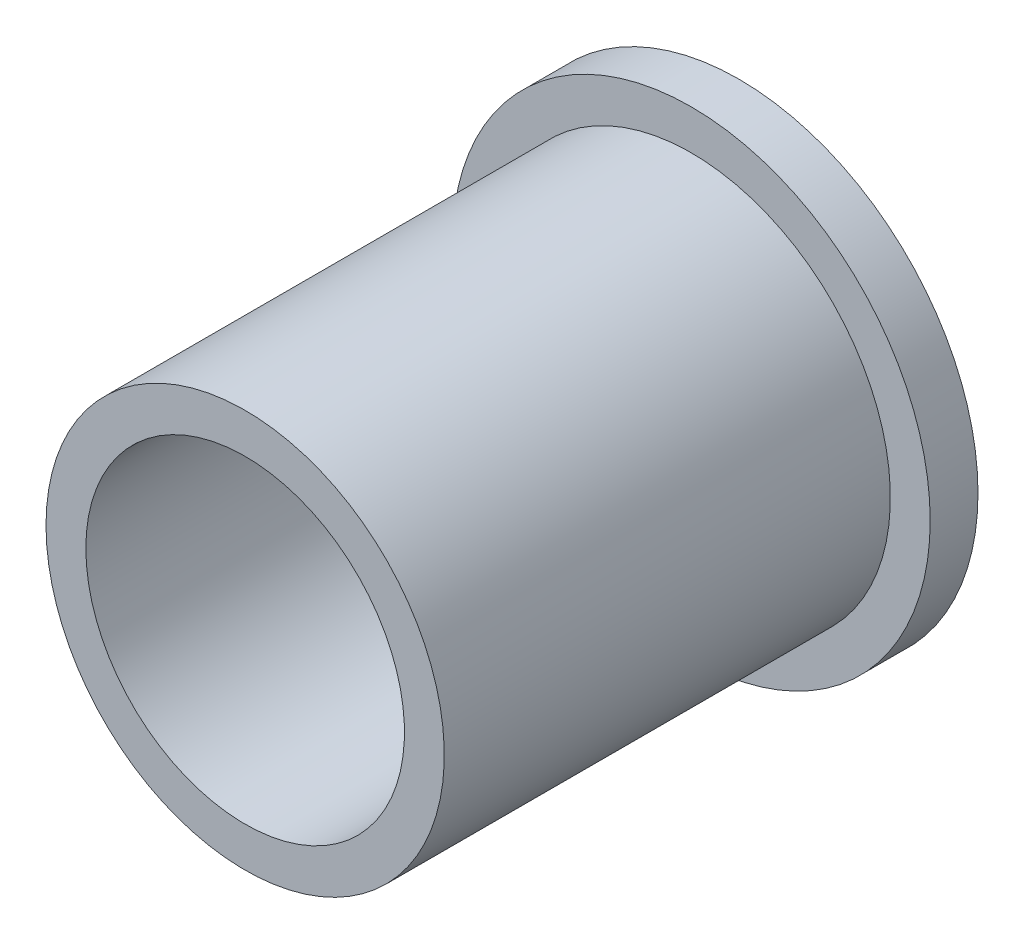
ISO-10303-21;
HEADER;
FILE_DESCRIPTION(('STEP AP214'),'2;1');
FILE_NAME('part.step','',(''),(''),'','','');
FILE_SCHEMA(('AUTOMOTIVE_DESIGN { 1 0 10303 214 1 1 1 1 }'));
ENDSEC;
DATA;
#1=APPLICATION_CONTEXT('core data for automotive mechanical design processes');
#2=APPLICATION_PROTOCOL_DEFINITION('international standard','automotive_design',2000,#1);
#3=PRODUCT_CONTEXT('',#1,'mechanical');
#4=PRODUCT('Part','Part','',(#3));
#5=PRODUCT_RELATED_PRODUCT_CATEGORY('part','',(#4));
#6=PRODUCT_DEFINITION_FORMATION('','',#4);
#7=PRODUCT_DEFINITION_CONTEXT('part definition',#1,'design');
#8=PRODUCT_DEFINITION('design','',#6,#7);
#9=PRODUCT_DEFINITION_SHAPE('','',#8);
#10=(LENGTH_UNIT() NAMED_UNIT(*) SI_UNIT(.MILLI.,.METRE.));
#11=(NAMED_UNIT(*) PLANE_ANGLE_UNIT() SI_UNIT($,.RADIAN.));
#12=(NAMED_UNIT(*) SI_UNIT($,.STERADIAN.) SOLID_ANGLE_UNIT());
#13=UNCERTAINTY_MEASURE_WITH_UNIT(LENGTH_MEASURE(1.E-05),#10,'distance_accuracy_value','');
#14=(GEOMETRIC_REPRESENTATION_CONTEXT(3) GLOBAL_UNCERTAINTY_ASSIGNED_CONTEXT((#13)) GLOBAL_UNIT_ASSIGNED_CONTEXT((#10,
#11,#12)) REPRESENTATION_CONTEXT('',''));
#15=CARTESIAN_POINT('',(0.,0.,0.));
#16=DIRECTION('',(0.,0.,1.));
#17=DIRECTION('',(1.,0.,0.));
#18=AXIS2_PLACEMENT_3D('',#15,#16,#17);
#19=CARTESIAN_POINT('',(10.,0.,0.));
#20=DIRECTION('',(0.,0.,1.));
#21=DIRECTION('',(1.,0.,0.));
#22=AXIS2_PLACEMENT_3D('',#19,#20,#21);
#23=PLANE('',#22);
#24=CARTESIAN_POINT('',(0.,0.,0.));
#25=DIRECTION('',(0.,0.,-1.));
#26=DIRECTION('',(-1.,0.,0.));
#27=AXIS2_PLACEMENT_3D('',#24,#25,#26);
#28=CIRCLE('',#27,10.);
#29=CARTESIAN_POINT('',(-10.,0.,0.));
#30=VERTEX_POINT('',#29);
#31=EDGE_CURVE('E10',#30,#30,#28,.T.);
#32=ORIENTED_EDGE('',*,*,#31,.F.);
#33=EDGE_LOOP('',(#32));
#34=FACE_BOUND('',#33,.T.);
#35=CARTESIAN_POINT('',(0.,0.,0.));
#36=DIRECTION('',(0.,0.,-1.));
#37=DIRECTION('',(-1.,0.,0.));
#38=AXIS2_PLACEMENT_3D('',#35,#36,#37);
#39=CIRCLE('',#38,15.);
#40=CARTESIAN_POINT('',(-15.,0.,0.));
#41=VERTEX_POINT('',#40);
#42=EDGE_CURVE('E55',#41,#41,#39,.T.);
#43=ORIENTED_EDGE('',*,*,#42,.T.);
#44=EDGE_LOOP('',(#43));
#45=FACE_BOUND('',#44,.T.);
#46=ADVANCED_FACE('F33',(#34,#45),#23,.F.);
#47=CARTESIAN_POINT('',(0.,0.,0.));
#48=DIRECTION('',(0.,0.,-1.));
#49=DIRECTION('',(-1.,0.,0.));
#50=AXIS2_PLACEMENT_3D('',#47,#48,#49);
#51=CYLINDRICAL_SURFACE('',#50,10.);
#52=CARTESIAN_POINT('',(0.,0.,31.));
#53=DIRECTION('',(0.,0.,-1.));
#54=DIRECTION('',(-1.,0.,0.));
#55=AXIS2_PLACEMENT_3D('',#52,#53,#54);
#56=CIRCLE('',#55,10.);
#57=CARTESIAN_POINT('',(-10.,0.,31.));
#58=VERTEX_POINT('',#57);
#59=EDGE_CURVE('E39',#58,#58,#56,.T.);
#60=ORIENTED_EDGE('',*,*,#59,.F.);
#61=EDGE_LOOP('',(#60));
#62=FACE_BOUND('',#61,.T.);
#63=ORIENTED_EDGE('',*,*,#31,.T.);
#64=EDGE_LOOP('',(#63));
#65=FACE_BOUND('',#64,.T.);
#66=ADVANCED_FACE('F80',(#62,#65),#51,.F.);
#67=CARTESIAN_POINT('',(10.,0.,31.));
#68=DIRECTION('',(0.,0.,-1.));
#69=DIRECTION('',(-1.,0.,0.));
#70=AXIS2_PLACEMENT_3D('',#67,#68,#69);
#71=PLANE('',#70);
#72=CARTESIAN_POINT('',(0.,0.,31.));
#73=DIRECTION('',(0.,0.,-1.));
#74=DIRECTION('',(-1.,0.,0.));
#75=AXIS2_PLACEMENT_3D('',#72,#73,#74);
#76=CIRCLE('',#75,12.5);
#77=CARTESIAN_POINT('',(-12.5,0.,31.));
#78=VERTEX_POINT('',#77);
#79=EDGE_CURVE('E43',#78,#78,#76,.T.);
#80=ORIENTED_EDGE('',*,*,#79,.F.);
#81=EDGE_LOOP('',(#80));
#82=FACE_BOUND('',#81,.T.);
#83=ORIENTED_EDGE('',*,*,#59,.T.);
#84=EDGE_LOOP('',(#83));
#85=FACE_BOUND('',#84,.T.);
#86=ADVANCED_FACE('F75',(#82,#85),#71,.F.);
#87=CARTESIAN_POINT('',(0.,0.,0.));
#88=DIRECTION('',(0.,0.,-1.));
#89=DIRECTION('',(-1.,0.,0.));
#90=AXIS2_PLACEMENT_3D('',#87,#88,#89);
#91=CYLINDRICAL_SURFACE('',#90,12.5);
#92=CARTESIAN_POINT('',(0.,0.,3.));
#93=DIRECTION('',(0.,0.,-1.));
#94=DIRECTION('',(-1.,0.,0.));
#95=AXIS2_PLACEMENT_3D('',#92,#93,#94);
#96=CIRCLE('',#95,12.5);
#97=CARTESIAN_POINT('',(-12.5,0.,3.));
#98=VERTEX_POINT('',#97);
#99=EDGE_CURVE('E47',#98,#98,#96,.T.);
#100=ORIENTED_EDGE('',*,*,#99,.F.);
#101=EDGE_LOOP('',(#100));
#102=FACE_BOUND('',#101,.T.);
#103=ORIENTED_EDGE('',*,*,#79,.T.);
#104=EDGE_LOOP('',(#103));
#105=FACE_BOUND('',#104,.T.);
#106=ADVANCED_FACE('F69',(#102,#105),#91,.T.);
#107=CARTESIAN_POINT('',(12.5,0.,3.));
#108=DIRECTION('',(0.,0.,-1.));
#109=DIRECTION('',(-1.,0.,0.));
#110=AXIS2_PLACEMENT_3D('',#107,#108,#109);
#111=PLANE('',#110);
#112=CARTESIAN_POINT('',(0.,0.,3.));
#113=DIRECTION('',(0.,0.,-1.));
#114=DIRECTION('',(-1.,0.,0.));
#115=AXIS2_PLACEMENT_3D('',#112,#113,#114);
#116=CIRCLE('',#115,15.);
#117=CARTESIAN_POINT('',(-15.,0.,3.));
#118=VERTEX_POINT('',#117);
#119=EDGE_CURVE('E52',#118,#118,#116,.T.);
#120=ORIENTED_EDGE('',*,*,#119,.F.);
#121=EDGE_LOOP('',(#120));
#122=FACE_BOUND('',#121,.T.);
#123=ORIENTED_EDGE('',*,*,#99,.T.);
#124=EDGE_LOOP('',(#123));
#125=FACE_BOUND('',#124,.T.);
#126=ADVANCED_FACE('F63',(#122,#125),#111,.F.);
#127=CARTESIAN_POINT('',(0.,0.,0.));
#128=DIRECTION('',(0.,0.,-1.));
#129=DIRECTION('',(-1.,0.,0.));
#130=AXIS2_PLACEMENT_3D('',#127,#128,#129);
#131=CYLINDRICAL_SURFACE('',#130,15.);
#132=ORIENTED_EDGE('',*,*,#42,.F.);
#133=EDGE_LOOP('',(#132));
#134=FACE_BOUND('',#133,.T.);
#135=ORIENTED_EDGE('',*,*,#119,.T.);
#136=EDGE_LOOP('',(#135));
#137=FACE_BOUND('',#136,.T.);
#138=ADVANCED_FACE('F60',(#134,#137),#131,.T.);
#139=CLOSED_SHELL('',(#46,#66,#86,#106,#126,#138));
#140=MANIFOLD_SOLID_BREP('B2',#139);
#141=ADVANCED_BREP_SHAPE_REPRESENTATION('',(#18,#140),#14);
#142=SHAPE_DEFINITION_REPRESENTATION(#9,#141);
ENDSEC;
END-ISO-10303-21;
